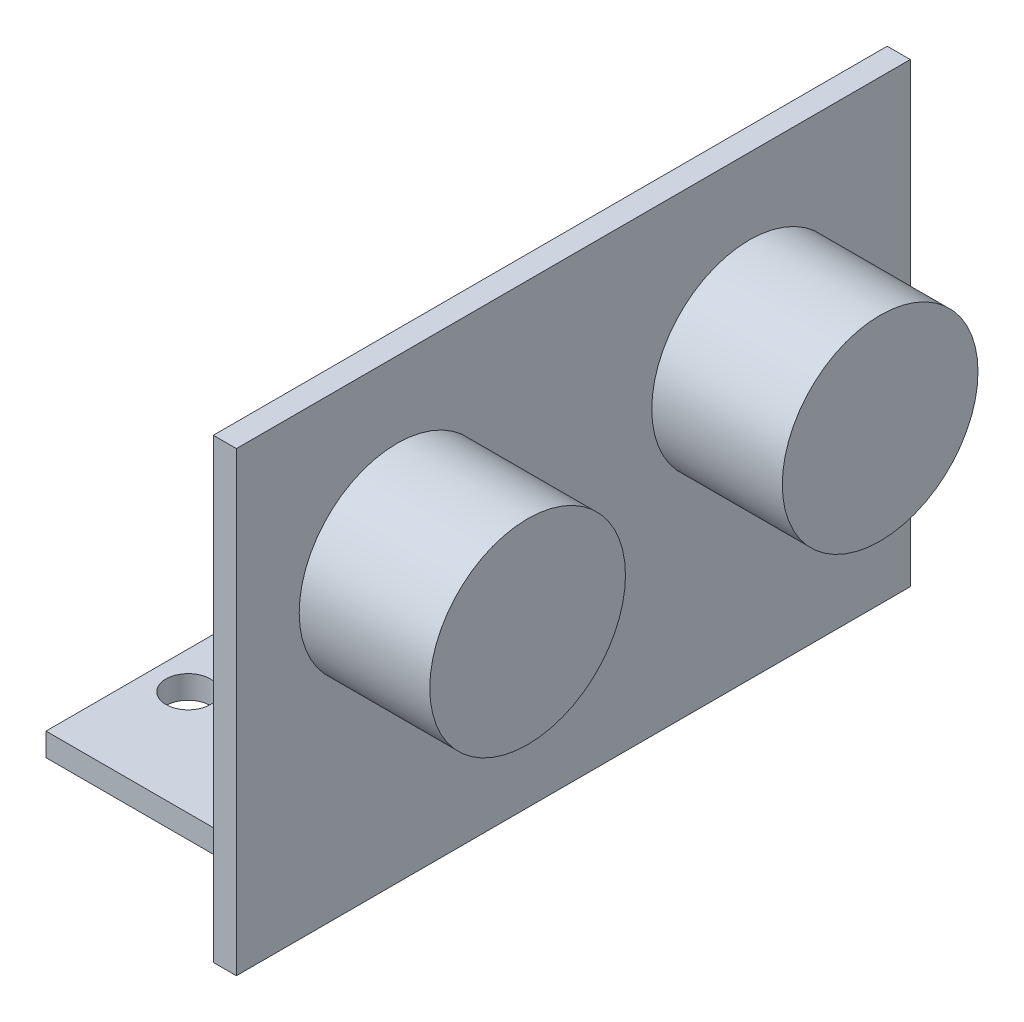
ISO-10303-21;
HEADER;
FILE_DESCRIPTION(('STEP AP214'),'2;1');
FILE_NAME('part.step','',(''),(''),'','','');
FILE_SCHEMA(('AUTOMOTIVE_DESIGN { 1 0 10303 214 1 1 1 1 }'));
ENDSEC;
DATA;
#1=APPLICATION_CONTEXT('core data for automotive mechanical design processes');
#2=APPLICATION_PROTOCOL_DEFINITION('international standard','automotive_design',2000,#1);
#3=PRODUCT_CONTEXT('',#1,'mechanical');
#4=PRODUCT('Part','Part','',(#3));
#5=PRODUCT_RELATED_PRODUCT_CATEGORY('part','',(#4));
#6=PRODUCT_DEFINITION_FORMATION('','',#4);
#7=PRODUCT_DEFINITION_CONTEXT('part definition',#1,'design');
#8=PRODUCT_DEFINITION('design','',#6,#7);
#9=PRODUCT_DEFINITION_SHAPE('','',#8);
#10=(LENGTH_UNIT() NAMED_UNIT(*) SI_UNIT(.MILLI.,.METRE.));
#11=(NAMED_UNIT(*) PLANE_ANGLE_UNIT() SI_UNIT($,.RADIAN.));
#12=(NAMED_UNIT(*) SI_UNIT($,.STERADIAN.) SOLID_ANGLE_UNIT());
#13=UNCERTAINTY_MEASURE_WITH_UNIT(LENGTH_MEASURE(1.E-05),#10,'distance_accuracy_value','');
#14=(GEOMETRIC_REPRESENTATION_CONTEXT(3) GLOBAL_UNCERTAINTY_ASSIGNED_CONTEXT((#13)) GLOBAL_UNIT_ASSIGNED_CONTEXT((#10,
#11,#12)) REPRESENTATION_CONTEXT('',''));
#15=CARTESIAN_POINT('',(0.,0.,0.));
#16=DIRECTION('',(0.,0.,1.));
#17=DIRECTION('',(1.,0.,0.));
#18=AXIS2_PLACEMENT_3D('',#15,#16,#17);
#19=CARTESIAN_POINT('',(0.,0.,0.));
#20=DIRECTION('',(1.,0.,0.));
#21=DIRECTION('',(0.,0.,-1.));
#22=AXIS2_PLACEMENT_3D('',#19,#20,#21);
#23=PLANE('',#22);
#24=DIRECTION('',(0.,-1.,0.));
#25=VECTOR('',#24,1.);
#26=CARTESIAN_POINT('',(0.,1.87,-47.02));
#27=LINE('',#26,#25);
#28=CARTESIAN_POINT('',(0.,1.87,-47.02));
#29=VERTEX_POINT('',#28);
#30=CARTESIAN_POINT('',(0.,0.,-47.02));
#31=VERTEX_POINT('',#30);
#32=EDGE_CURVE('E55',#29,#31,#27,.T.);
#33=ORIENTED_EDGE('',*,*,#32,.F.);
#34=DIRECTION('',(0.,0.,-1.));
#35=VECTOR('',#34,1.);
#36=CARTESIAN_POINT('',(0.,1.87,-47.02));
#37=LINE('',#36,#35);
#38=CARTESIAN_POINT('',(0.,1.87,-7.59));
#39=VERTEX_POINT('',#38);
#40=EDGE_CURVE('E123',#39,#29,#37,.T.);
#41=ORIENTED_EDGE('',*,*,#40,.F.);
#42=DIRECTION('',(0.,1.,0.));
#43=VECTOR('',#42,1.);
#44=CARTESIAN_POINT('',(0.,1.87,-7.59));
#45=LINE('',#44,#43);
#46=CARTESIAN_POINT('',(0.,0.,-7.59));
#47=VERTEX_POINT('',#46);
#48=EDGE_CURVE('E179',#47,#39,#45,.T.);
#49=ORIENTED_EDGE('',*,*,#48,.F.);
#50=DIRECTION('',(0.,0.,-1.));
#51=VECTOR('',#50,1.);
#52=CARTESIAN_POINT('',(0.,0.,0.));
#53=LINE('',#52,#51);
#54=CARTESIAN_POINT('',(0.,0.,0.));
#55=VERTEX_POINT('',#54);
#56=EDGE_CURVE('E148',#55,#47,#53,.T.);
#57=ORIENTED_EDGE('',*,*,#56,.F.);
#58=DIRECTION('',(0.,1.,0.));
#59=VECTOR('',#58,1.);
#60=CARTESIAN_POINT('',(0.,0.,0.));
#61=LINE('',#60,#59);
#62=CARTESIAN_POINT('',(0.,37.,0.));
#63=VERTEX_POINT('',#62);
#64=EDGE_CURVE('E161',#55,#63,#61,.T.);
#65=ORIENTED_EDGE('',*,*,#64,.T.);
#66=DIRECTION('',(0.,0.,1.));
#67=VECTOR('',#66,1.);
#68=CARTESIAN_POINT('',(0.,37.,-54.61));
#69=LINE('',#68,#67);
#70=CARTESIAN_POINT('',(0.,37.,-54.61));
#71=VERTEX_POINT('',#70);
#72=EDGE_CURVE('E158',#71,#63,#69,.T.);
#73=ORIENTED_EDGE('',*,*,#72,.F.);
#74=DIRECTION('',(0.,1.,0.));
#75=VECTOR('',#74,1.);
#76=CARTESIAN_POINT('',(0.,0.,-54.61));
#77=LINE('',#76,#75);
#78=CARTESIAN_POINT('',(0.,0.,-54.61));
#79=VERTEX_POINT('',#78);
#80=EDGE_CURVE('E141',#79,#71,#77,.T.);
#81=ORIENTED_EDGE('',*,*,#80,.F.);
#82=EDGE_CURVE('E60',#31,#79,#53,.T.);
#83=ORIENTED_EDGE('',*,*,#82,.F.);
#84=EDGE_LOOP('',(#33,#41,#49,#57,#65,#73,#81,#83));
#85=FACE_BOUND('',#84,.T.);
#86=ADVANCED_FACE('F39',(#85),#23,.F.);
#87=CARTESIAN_POINT('',(1.87,0.,-54.61));
#88=DIRECTION('',(0.,0.,1.));
#89=DIRECTION('',(1.,0.,0.));
#90=AXIS2_PLACEMENT_3D('',#87,#88,#89);
#91=PLANE('',#90);
#92=ORIENTED_EDGE('',*,*,#80,.T.);
#93=DIRECTION('',(-1.,0.,0.));
#94=VECTOR('',#93,1.);
#95=CARTESIAN_POINT('',(1.87,37.,-54.61));
#96=LINE('',#95,#94);
#97=CARTESIAN_POINT('',(1.87,37.,-54.61));
#98=VERTEX_POINT('',#97);
#99=EDGE_CURVE('E11',#98,#71,#96,.T.);
#100=ORIENTED_EDGE('',*,*,#99,.F.);
#101=DIRECTION('',(0.,1.,0.));
#102=VECTOR('',#101,1.);
#103=CARTESIAN_POINT('',(1.87,0.,-54.61));
#104=LINE('',#103,#102);
#105=CARTESIAN_POINT('',(1.87,0.,-54.61));
#106=VERTEX_POINT('',#105);
#107=EDGE_CURVE('E144',#106,#98,#104,.T.);
#108=ORIENTED_EDGE('',*,*,#107,.F.);
#109=DIRECTION('',(-1.,0.,0.));
#110=VECTOR('',#109,1.);
#111=CARTESIAN_POINT('',(1.87,0.,-54.61));
#112=LINE('',#111,#110);
#113=EDGE_CURVE('E155',#106,#79,#112,.T.);
#114=ORIENTED_EDGE('',*,*,#113,.T.);
#115=EDGE_LOOP('',(#92,#100,#108,#114));
#116=FACE_BOUND('',#115,.T.);
#117=ADVANCED_FACE('F41',(#116),#91,.F.);
#118=CARTESIAN_POINT('',(1.87,37.,-54.61));
#119=DIRECTION('',(0.,-1.,0.));
#120=DIRECTION('',(0.,0.,-1.));
#121=AXIS2_PLACEMENT_3D('',#118,#119,#120);
#122=PLANE('',#121);
#123=ORIENTED_EDGE('',*,*,#72,.T.);
#124=DIRECTION('',(-1.,0.,0.));
#125=VECTOR('',#124,1.);
#126=CARTESIAN_POINT('',(1.87,37.,0.));
#127=LINE('',#126,#125);
#128=CARTESIAN_POINT('',(1.87,37.,0.));
#129=VERTEX_POINT('',#128);
#130=EDGE_CURVE('E48',#129,#63,#127,.T.);
#131=ORIENTED_EDGE('',*,*,#130,.F.);
#132=DIRECTION('',(0.,0.,1.));
#133=VECTOR('',#132,1.);
#134=CARTESIAN_POINT('',(1.87,37.,-54.61));
#135=LINE('',#134,#133);
#136=EDGE_CURVE('E147',#98,#129,#135,.T.);
#137=ORIENTED_EDGE('',*,*,#136,.F.);
#138=ORIENTED_EDGE('',*,*,#99,.T.);
#139=EDGE_LOOP('',(#123,#131,#137,#138));
#140=FACE_BOUND('',#139,.T.);
#141=ADVANCED_FACE('F175',(#140),#122,.F.);
#142=CARTESIAN_POINT('',(1.87,0.,0.));
#143=DIRECTION('',(0.,0.,1.));
#144=DIRECTION('',(1.,0.,0.));
#145=AXIS2_PLACEMENT_3D('',#142,#143,#144);
#146=PLANE('',#145);
#147=ORIENTED_EDGE('',*,*,#64,.F.);
#148=DIRECTION('',(-1.,0.,0.));
#149=VECTOR('',#148,1.);
#150=CARTESIAN_POINT('',(1.87,0.,0.));
#151=LINE('',#150,#149);
#152=CARTESIAN_POINT('',(1.87,0.,0.));
#153=VERTEX_POINT('',#152);
#154=EDGE_CURVE('E167',#153,#55,#151,.T.);
#155=ORIENTED_EDGE('',*,*,#154,.F.);
#156=DIRECTION('',(0.,1.,0.));
#157=VECTOR('',#156,1.);
#158=CARTESIAN_POINT('',(1.87,0.,0.));
#159=LINE('',#158,#157);
#160=EDGE_CURVE('E150',#153,#129,#159,.T.);
#161=ORIENTED_EDGE('',*,*,#160,.T.);
#162=ORIENTED_EDGE('',*,*,#130,.T.);
#163=EDGE_LOOP('',(#147,#155,#161,#162));
#164=FACE_BOUND('',#163,.T.);
#165=ADVANCED_FACE('F172',(#164),#146,.T.);
#166=CARTESIAN_POINT('',(1.87,0.,0.));
#167=DIRECTION('',(0.,1.,0.));
#168=DIRECTION('',(0.,0.,1.));
#169=AXIS2_PLACEMENT_3D('',#166,#167,#168);
#170=PLANE('',#169);
#171=CARTESIAN_POINT('',(-18.15,0.,-38.5));
#172=DIRECTION('',(0.,1.,0.));
#173=DIRECTION('',(0.,0.,1.));
#174=AXIS2_PLACEMENT_3D('',#171,#172,#173);
#175=CIRCLE('',#174,1.79999999999999);
#176=CARTESIAN_POINT('',(-18.15,0.,-36.7));
#177=VERTEX_POINT('',#176);
#178=EDGE_CURVE('E43',#177,#177,#175,.T.);
#179=ORIENTED_EDGE('',*,*,#178,.T.);
#180=EDGE_LOOP('',(#179));
#181=FACE_BOUND('',#180,.T.);
#182=CARTESIAN_POINT('',(-18.15,0.,-16.11));
#183=DIRECTION('',(0.,1.,0.));
#184=DIRECTION('',(0.,0.,1.));
#185=AXIS2_PLACEMENT_3D('',#182,#183,#184);
#186=CIRCLE('',#185,1.79999999999999);
#187=CARTESIAN_POINT('',(-18.15,0.,-14.31));
#188=VERTEX_POINT('',#187);
#189=EDGE_CURVE('E190',#188,#188,#186,.T.);
#190=ORIENTED_EDGE('',*,*,#189,.T.);
#191=EDGE_LOOP('',(#190));
#192=FACE_BOUND('',#191,.T.);
#193=ORIENTED_EDGE('',*,*,#56,.T.);
#194=DIRECTION('',(1.,0.,0.));
#195=VECTOR('',#194,1.);
#196=CARTESIAN_POINT('',(-21.15,0.,-7.59));
#197=LINE('',#196,#195);
#198=CARTESIAN_POINT('',(-21.15,0.,-7.59));
#199=VERTEX_POINT('',#198);
#200=EDGE_CURVE('E110',#199,#47,#197,.T.);
#201=ORIENTED_EDGE('',*,*,#200,.F.);
#202=DIRECTION('',(0.,0.,1.));
#203=VECTOR('',#202,1.);
#204=CARTESIAN_POINT('',(-21.15,0.,-47.02));
#205=LINE('',#204,#203);
#206=CARTESIAN_POINT('',(-21.15,0.,-47.02));
#207=VERTEX_POINT('',#206);
#208=EDGE_CURVE('E103',#207,#199,#205,.T.);
#209=ORIENTED_EDGE('',*,*,#208,.F.);
#210=DIRECTION('',(1.,0.,0.));
#211=VECTOR('',#210,1.);
#212=CARTESIAN_POINT('',(-21.15,0.,-47.02));
#213=LINE('',#212,#211);
#214=EDGE_CURVE('E108',#207,#31,#213,.T.);
#215=ORIENTED_EDGE('',*,*,#214,.T.);
#216=ORIENTED_EDGE('',*,*,#82,.T.);
#217=ORIENTED_EDGE('',*,*,#113,.F.);
#218=DIRECTION('',(0.,0.,-1.));
#219=VECTOR('',#218,1.);
#220=CARTESIAN_POINT('',(1.87,0.,0.));
#221=LINE('',#220,#219);
#222=EDGE_CURVE('E153',#153,#106,#221,.T.);
#223=ORIENTED_EDGE('',*,*,#222,.F.);
#224=ORIENTED_EDGE('',*,*,#154,.T.);
#225=EDGE_LOOP('',(#193,#201,#209,#215,#216,#217,#223,#224));
#226=FACE_BOUND('',#225,.T.);
#227=ADVANCED_FACE('F106',(#181,#192,#226),#170,.F.);
#228=CARTESIAN_POINT('',(1.87,0.,0.));
#229=DIRECTION('',(1.,0.,0.));
#230=DIRECTION('',(0.,0.,-1.));
#231=AXIS2_PLACEMENT_3D('',#228,#229,#230);
#232=PLANE('',#231);
#233=CARTESIAN_POINT('',(1.87,22.93,-41.59));
#234=DIRECTION('',(1.,0.,0.));
#235=DIRECTION('',(0.,0.,-1.));
#236=AXIS2_PLACEMENT_3D('',#233,#234,#235);
#237=CIRCLE('',#236,7.93);
#238=CARTESIAN_POINT('',(1.87,22.93,-49.52));
#239=VERTEX_POINT('',#238);
#240=EDGE_CURVE('E129',#239,#239,#237,.T.);
#241=ORIENTED_EDGE('',*,*,#240,.F.);
#242=EDGE_LOOP('',(#241));
#243=FACE_BOUND('',#242,.T.);
#244=CARTESIAN_POINT('',(1.87,22.93,-13.02));
#245=DIRECTION('',(1.,0.,0.));
#246=DIRECTION('',(0.,0.,-1.));
#247=AXIS2_PLACEMENT_3D('',#244,#245,#246);
#248=CIRCLE('',#247,7.93);
#249=CARTESIAN_POINT('',(1.87,22.93,-20.95));
#250=VERTEX_POINT('',#249);
#251=EDGE_CURVE('E136',#250,#250,#248,.T.);
#252=ORIENTED_EDGE('',*,*,#251,.F.);
#253=EDGE_LOOP('',(#252));
#254=FACE_BOUND('',#253,.T.);
#255=ORIENTED_EDGE('',*,*,#107,.T.);
#256=ORIENTED_EDGE('',*,*,#136,.T.);
#257=ORIENTED_EDGE('',*,*,#160,.F.);
#258=ORIENTED_EDGE('',*,*,#222,.T.);
#259=EDGE_LOOP('',(#255,#256,#257,#258));
#260=FACE_BOUND('',#259,.T.);
#261=ADVANCED_FACE('F219',(#243,#254,#260),#232,.T.);
#262=CARTESIAN_POINT('',(12.45,22.93,-13.02));
#263=DIRECTION('',(-1.,0.,0.));
#264=DIRECTION('',(0.,0.,1.));
#265=AXIS2_PLACEMENT_3D('',#262,#263,#264);
#266=CYLINDRICAL_SURFACE('',#265,7.93);
#267=CARTESIAN_POINT('',(12.45,22.93,-13.02));
#268=DIRECTION('',(1.,0.,0.));
#269=DIRECTION('',(0.,0.,-1.));
#270=AXIS2_PLACEMENT_3D('',#267,#268,#269);
#271=CIRCLE('',#270,7.93);
#272=CARTESIAN_POINT('',(12.45,22.93,-20.95));
#273=VERTEX_POINT('',#272);
#274=EDGE_CURVE('E138',#273,#273,#271,.T.);
#275=ORIENTED_EDGE('',*,*,#274,.F.);
#276=EDGE_LOOP('',(#275));
#277=FACE_BOUND('',#276,.T.);
#278=ORIENTED_EDGE('',*,*,#251,.T.);
#279=EDGE_LOOP('',(#278));
#280=FACE_BOUND('',#279,.T.);
#281=ADVANCED_FACE('F242',(#277,#280),#266,.T.);
#282=CARTESIAN_POINT('',(12.45,22.93,-13.02));
#283=DIRECTION('',(1.,0.,0.));
#284=DIRECTION('',(0.,0.,-1.));
#285=AXIS2_PLACEMENT_3D('',#282,#283,#284);
#286=PLANE('',#285);
#287=ORIENTED_EDGE('',*,*,#274,.T.);
#288=EDGE_LOOP('',(#287));
#289=FACE_BOUND('',#288,.T.);
#290=ADVANCED_FACE('F250',(#289),#286,.T.);
#291=CARTESIAN_POINT('',(12.45,22.93,-41.59));
#292=DIRECTION('',(-1.,0.,0.));
#293=DIRECTION('',(0.,0.,1.));
#294=AXIS2_PLACEMENT_3D('',#291,#292,#293);
#295=CYLINDRICAL_SURFACE('',#294,7.93);
#296=CARTESIAN_POINT('',(12.45,22.93,-41.59));
#297=DIRECTION('',(1.,0.,0.));
#298=DIRECTION('',(0.,0.,-1.));
#299=AXIS2_PLACEMENT_3D('',#296,#297,#298);
#300=CIRCLE('',#299,7.93);
#301=CARTESIAN_POINT('',(12.45,22.93,-49.52));
#302=VERTEX_POINT('',#301);
#303=EDGE_CURVE('E126',#302,#302,#300,.T.);
#304=ORIENTED_EDGE('',*,*,#303,.F.);
#305=EDGE_LOOP('',(#304));
#306=FACE_BOUND('',#305,.T.);
#307=ORIENTED_EDGE('',*,*,#240,.T.);
#308=EDGE_LOOP('',(#307));
#309=FACE_BOUND('',#308,.T.);
#310=ADVANCED_FACE('F258',(#306,#309),#295,.T.);
#311=CARTESIAN_POINT('',(12.45,22.93,-41.59));
#312=DIRECTION('',(1.,0.,0.));
#313=DIRECTION('',(0.,0.,-1.));
#314=AXIS2_PLACEMENT_3D('',#311,#312,#313);
#315=PLANE('',#314);
#316=ORIENTED_EDGE('',*,*,#303,.T.);
#317=EDGE_LOOP('',(#316));
#318=FACE_BOUND('',#317,.T.);
#319=ADVANCED_FACE('F266',(#318),#315,.T.);
#320=CARTESIAN_POINT('',(-21.15,1.87,-47.02));
#321=DIRECTION('',(0.,0.,1.));
#322=DIRECTION('',(1.,0.,0.));
#323=AXIS2_PLACEMENT_3D('',#320,#321,#322);
#324=PLANE('',#323);
#325=ORIENTED_EDGE('',*,*,#32,.T.);
#326=ORIENTED_EDGE('',*,*,#214,.F.);
#327=DIRECTION('',(0.,-1.,0.));
#328=VECTOR('',#327,1.);
#329=CARTESIAN_POINT('',(-21.15,1.87,-47.02));
#330=LINE('',#329,#328);
#331=CARTESIAN_POINT('',(-21.15,1.87,-47.02));
#332=VERTEX_POINT('',#331);
#333=EDGE_CURVE('E114',#332,#207,#330,.T.);
#334=ORIENTED_EDGE('',*,*,#333,.F.);
#335=DIRECTION('',(1.,0.,0.));
#336=VECTOR('',#335,1.);
#337=CARTESIAN_POINT('',(-21.15,1.87,-47.02));
#338=LINE('',#337,#336);
#339=EDGE_CURVE('E186',#332,#29,#338,.T.);
#340=ORIENTED_EDGE('',*,*,#339,.T.);
#341=EDGE_LOOP('',(#325,#326,#334,#340));
#342=FACE_BOUND('',#341,.T.);
#343=ADVANCED_FACE('F125',(#342),#324,.F.);
#344=CARTESIAN_POINT('',(-21.15,1.87,-7.59));
#345=DIRECTION('',(0.,0.,-1.));
#346=DIRECTION('',(-1.,0.,0.));
#347=AXIS2_PLACEMENT_3D('',#344,#345,#346);
#348=PLANE('',#347);
#349=ORIENTED_EDGE('',*,*,#48,.T.);
#350=DIRECTION('',(1.,0.,0.));
#351=VECTOR('',#350,1.);
#352=CARTESIAN_POINT('',(-21.15,1.87,-7.59));
#353=LINE('',#352,#351);
#354=CARTESIAN_POINT('',(-21.15,1.87,-7.59));
#355=VERTEX_POINT('',#354);
#356=EDGE_CURVE('E131',#355,#39,#353,.T.);
#357=ORIENTED_EDGE('',*,*,#356,.F.);
#358=DIRECTION('',(0.,1.,0.));
#359=VECTOR('',#358,1.);
#360=CARTESIAN_POINT('',(-21.15,1.87,-7.59));
#361=LINE('',#360,#359);
#362=EDGE_CURVE('E113',#199,#355,#361,.T.);
#363=ORIENTED_EDGE('',*,*,#362,.F.);
#364=ORIENTED_EDGE('',*,*,#200,.T.);
#365=EDGE_LOOP('',(#349,#357,#363,#364));
#366=FACE_BOUND('',#365,.T.);
#367=ADVANCED_FACE('F182',(#366),#348,.F.);
#368=CARTESIAN_POINT('',(-21.15,1.87,-47.02));
#369=DIRECTION('',(0.,-1.,0.));
#370=DIRECTION('',(0.,0.,-1.));
#371=AXIS2_PLACEMENT_3D('',#368,#369,#370);
#372=PLANE('',#371);
#373=CARTESIAN_POINT('',(-18.15,1.87,-38.5));
#374=DIRECTION('',(0.,1.,0.));
#375=DIRECTION('',(0.,0.,1.));
#376=AXIS2_PLACEMENT_3D('',#373,#374,#375);
#377=CIRCLE('',#376,1.79999999999999);
#378=CARTESIAN_POINT('',(-18.15,1.87,-36.7));
#379=VERTEX_POINT('',#378);
#380=EDGE_CURVE('E334',#379,#379,#377,.T.);
#381=ORIENTED_EDGE('',*,*,#380,.F.);
#382=EDGE_LOOP('',(#381));
#383=FACE_BOUND('',#382,.T.);
#384=CARTESIAN_POINT('',(-18.15,1.87,-16.11));
#385=DIRECTION('',(0.,1.,0.));
#386=DIRECTION('',(0.,0.,1.));
#387=AXIS2_PLACEMENT_3D('',#384,#385,#386);
#388=CIRCLE('',#387,1.79999999999999);
#389=CARTESIAN_POINT('',(-18.15,1.87,-14.31));
#390=VERTEX_POINT('',#389);
#391=EDGE_CURVE('E337',#390,#390,#388,.T.);
#392=ORIENTED_EDGE('',*,*,#391,.F.);
#393=EDGE_LOOP('',(#392));
#394=FACE_BOUND('',#393,.T.);
#395=ORIENTED_EDGE('',*,*,#40,.T.);
#396=ORIENTED_EDGE('',*,*,#339,.F.);
#397=DIRECTION('',(0.,0.,-1.));
#398=VECTOR('',#397,1.);
#399=CARTESIAN_POINT('',(-21.15,1.87,-47.02));
#400=LINE('',#399,#398);
#401=EDGE_CURVE('E119',#355,#332,#400,.T.);
#402=ORIENTED_EDGE('',*,*,#401,.F.);
#403=ORIENTED_EDGE('',*,*,#356,.T.);
#404=EDGE_LOOP('',(#395,#396,#402,#403));
#405=FACE_BOUND('',#404,.T.);
#406=ADVANCED_FACE('F194',(#383,#394,#405),#372,.F.);
#407=CARTESIAN_POINT('',(-21.15,0.,0.));
#408=DIRECTION('',(-1.,0.,0.));
#409=DIRECTION('',(0.,0.,1.));
#410=AXIS2_PLACEMENT_3D('',#407,#408,#409);
#411=PLANE('',#410);
#412=ORIENTED_EDGE('',*,*,#333,.T.);
#413=ORIENTED_EDGE('',*,*,#208,.T.);
#414=ORIENTED_EDGE('',*,*,#362,.T.);
#415=ORIENTED_EDGE('',*,*,#401,.T.);
#416=EDGE_LOOP('',(#412,#413,#414,#415));
#417=FACE_BOUND('',#416,.T.);
#418=ADVANCED_FACE('F117',(#417),#411,.T.);
#419=CARTESIAN_POINT('',(-18.15,1.87,-16.11));
#420=DIRECTION('',(0.,1.,0.));
#421=DIRECTION('',(0.,0.,1.));
#422=AXIS2_PLACEMENT_3D('',#419,#420,#421);
#423=CYLINDRICAL_SURFACE('',#422,1.79999999999999);
#424=ORIENTED_EDGE('',*,*,#391,.T.);
#425=EDGE_LOOP('',(#424));
#426=FACE_BOUND('',#425,.T.);
#427=ORIENTED_EDGE('',*,*,#189,.F.);
#428=EDGE_LOOP('',(#427));
#429=FACE_BOUND('',#428,.T.);
#430=ADVANCED_FACE('F203',(#426,#429),#423,.F.);
#431=CARTESIAN_POINT('',(-18.15,1.87,-38.5));
#432=DIRECTION('',(0.,1.,0.));
#433=DIRECTION('',(0.,0.,1.));
#434=AXIS2_PLACEMENT_3D('',#431,#432,#433);
#435=CYLINDRICAL_SURFACE('',#434,1.79999999999999);
#436=ORIENTED_EDGE('',*,*,#380,.T.);
#437=EDGE_LOOP('',(#436));
#438=FACE_BOUND('',#437,.T.);
#439=ORIENTED_EDGE('',*,*,#178,.F.);
#440=EDGE_LOOP('',(#439));
#441=FACE_BOUND('',#440,.T.);
#442=ADVANCED_FACE('F319',(#438,#441),#435,.F.);
#443=CLOSED_SHELL('',(#86,#117,#141,#165,#227,#261,#281,#290,#310,#319,#343,#367,#406,#418,#430,#442));
#444=MANIFOLD_SOLID_BREP('B2',#443);
#445=ADVANCED_BREP_SHAPE_REPRESENTATION('',(#18,#444),#14);
#446=SHAPE_DEFINITION_REPRESENTATION(#9,#445);
ENDSEC;
END-ISO-10303-21;
